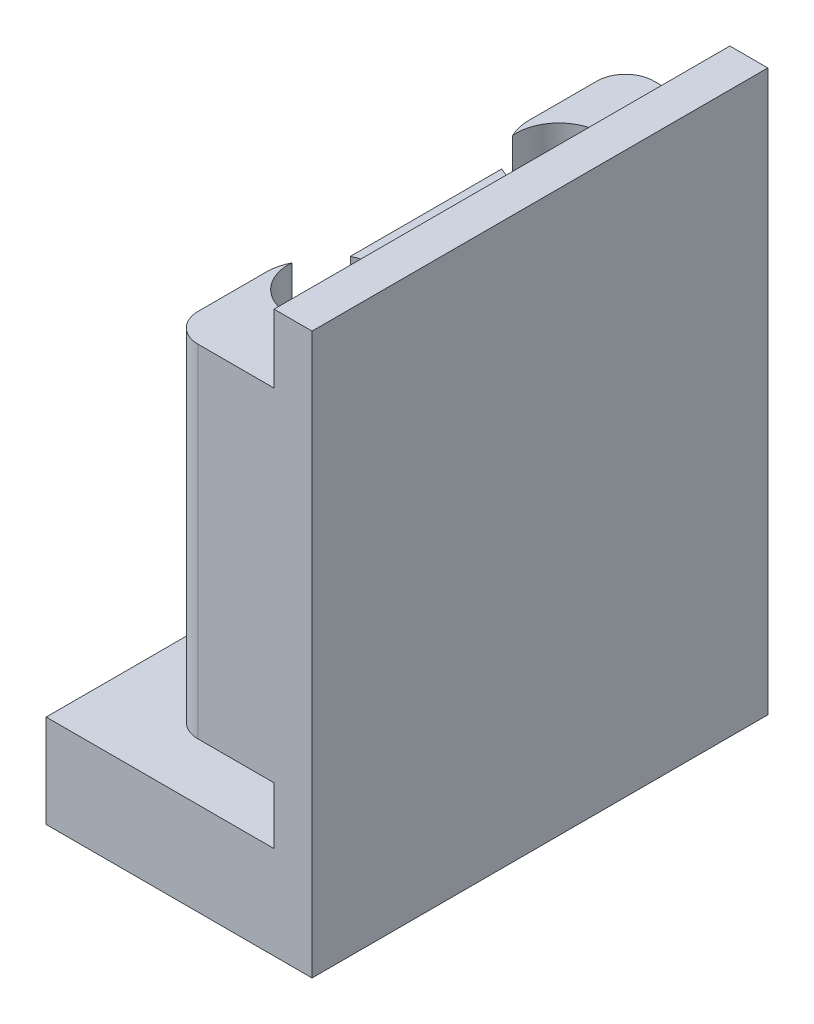
ISO-10303-21;
HEADER;
FILE_DESCRIPTION(('STEP AP214'),'2;1');
FILE_NAME('part.step','',(''),(''),'','','');
FILE_SCHEMA(('AUTOMOTIVE_DESIGN { 1 0 10303 214 1 1 1 1 }'));
ENDSEC;
DATA;
#1=APPLICATION_CONTEXT('core data for automotive mechanical design processes');
#2=APPLICATION_PROTOCOL_DEFINITION('international standard','automotive_design',2000,#1);
#3=PRODUCT_CONTEXT('',#1,'mechanical');
#4=PRODUCT('Part','Part','',(#3));
#5=PRODUCT_RELATED_PRODUCT_CATEGORY('part','',(#4));
#6=PRODUCT_DEFINITION_FORMATION('','',#4);
#7=PRODUCT_DEFINITION_CONTEXT('part definition',#1,'design');
#8=PRODUCT_DEFINITION('design','',#6,#7);
#9=PRODUCT_DEFINITION_SHAPE('','',#8);
#10=(LENGTH_UNIT() NAMED_UNIT(*) SI_UNIT(.MILLI.,.METRE.));
#11=(NAMED_UNIT(*) PLANE_ANGLE_UNIT() SI_UNIT($,.RADIAN.));
#12=(NAMED_UNIT(*) SI_UNIT($,.STERADIAN.) SOLID_ANGLE_UNIT());
#13=UNCERTAINTY_MEASURE_WITH_UNIT(LENGTH_MEASURE(1.E-05),#10,'distance_accuracy_value','');
#14=(GEOMETRIC_REPRESENTATION_CONTEXT(3) GLOBAL_UNCERTAINTY_ASSIGNED_CONTEXT((#13)) GLOBAL_UNIT_ASSIGNED_CONTEXT((#10,
#11,#12)) REPRESENTATION_CONTEXT('',''));
#15=CARTESIAN_POINT('',(0.,0.,0.));
#16=DIRECTION('',(0.,0.,1.));
#17=DIRECTION('',(1.,0.,0.));
#18=AXIS2_PLACEMENT_3D('',#15,#16,#17);
#19=CARTESIAN_POINT('',(0.500000000000001,25.9,12.));
#20=DIRECTION('',(1.,0.,0.));
#21=DIRECTION('',(0.,0.,-1.));
#22=AXIS2_PLACEMENT_3D('',#19,#20,#21);
#23=PLANE('',#22);
#24=DIRECTION('',(0.,0.,1.));
#25=VECTOR('',#24,1.);
#26=CARTESIAN_POINT('',(0.500000000000001,25.9,12.));
#27=LINE('',#26,#25);
#28=CARTESIAN_POINT('',(0.500000000000001,25.9,-10.5));
#29=VERTEX_POINT('',#28);
#30=CARTESIAN_POINT('',(0.500000000000001,25.9,-6.91628784747792));
#31=VERTEX_POINT('',#30);
#32=EDGE_CURVE('E200',#29,#31,#27,.T.);
#33=ORIENTED_EDGE('',*,*,#32,.F.);
#34=DIRECTION('',(0.,-1.,0.));
#35=VECTOR('',#34,1.);
#36=CARTESIAN_POINT('',(0.500000000000001,25.9,-10.5));
#37=LINE('',#36,#35);
#38=CARTESIAN_POINT('',(0.500000000000001,7.9,-10.5));
#39=VERTEX_POINT('',#38);
#40=EDGE_CURVE('E275',#29,#39,#37,.T.);
#41=ORIENTED_EDGE('',*,*,#40,.T.);
#42=DIRECTION('',(0.,0.,1.));
#43=VECTOR('',#42,1.);
#44=CARTESIAN_POINT('',(0.500000000000001,7.9,12.));
#45=LINE('',#44,#43);
#46=CARTESIAN_POINT('',(0.500000000000001,7.9,-6.91628784747792));
#47=VERTEX_POINT('',#46);
#48=EDGE_CURVE('E208',#39,#47,#45,.T.);
#49=ORIENTED_EDGE('',*,*,#48,.T.);
#50=DIRECTION('',(0.,1.,0.));
#51=VECTOR('',#50,1.);
#52=CARTESIAN_POINT('',(0.500000000000001,25.9,-6.91628784747792));
#53=LINE('',#52,#51);
#54=EDGE_CURVE('E268',#47,#31,#53,.T.);
#55=ORIENTED_EDGE('',*,*,#54,.T.);
#56=EDGE_LOOP('',(#33,#41,#49,#55));
#57=FACE_BOUND('',#56,.T.);
#58=ADVANCED_FACE('F34',(#57),#23,.F.);
#59=CARTESIAN_POINT('',(6.,29.5,12.));
#60=DIRECTION('',(1.,0.,0.));
#61=DIRECTION('',(0.,0.,-1.));
#62=AXIS2_PLACEMENT_3D('',#59,#60,#61);
#63=PLANE('',#62);
#64=DIRECTION('',(0.,0.,-1.));
#65=VECTOR('',#64,1.);
#66=CARTESIAN_POINT('',(6.,7.9,12.));
#67=LINE('',#66,#65);
#68=CARTESIAN_POINT('',(6.,7.9,12.));
#69=VERTEX_POINT('',#68);
#70=CARTESIAN_POINT('',(6.,7.9,-12.));
#71=VERTEX_POINT('',#70);
#72=EDGE_CURVE('E184',#69,#71,#67,.T.);
#73=ORIENTED_EDGE('',*,*,#72,.T.);
#74=DIRECTION('',(0.,-1.,0.));
#75=VECTOR('',#74,1.);
#76=CARTESIAN_POINT('',(6.,29.5,-12.));
#77=LINE('',#76,#75);
#78=CARTESIAN_POINT('',(6.,4.9,-12.));
#79=VERTEX_POINT('',#78);
#80=EDGE_CURVE('E220',#71,#79,#77,.T.);
#81=ORIENTED_EDGE('',*,*,#80,.T.);
#82=DIRECTION('',(0.,0.,-1.));
#83=VECTOR('',#82,1.);
#84=CARTESIAN_POINT('',(6.,4.9,12.));
#85=LINE('',#84,#83);
#86=CARTESIAN_POINT('',(6.,4.9,12.));
#87=VERTEX_POINT('',#86);
#88=EDGE_CURVE('E236',#87,#79,#85,.T.);
#89=ORIENTED_EDGE('',*,*,#88,.F.);
#90=DIRECTION('',(0.,-1.,0.));
#91=VECTOR('',#90,1.);
#92=CARTESIAN_POINT('',(6.,29.5,12.));
#93=LINE('',#92,#91);
#94=EDGE_CURVE('E231',#69,#87,#93,.T.);
#95=ORIENTED_EDGE('',*,*,#94,.F.);
#96=EDGE_LOOP('',(#73,#81,#89,#95));
#97=FACE_BOUND('',#96,.T.);
#98=ADVANCED_FACE('F301',(#97),#63,.F.);
#99=CARTESIAN_POINT('',(-6.,4.9,-12.));
#100=DIRECTION('',(0.,0.,1.));
#101=DIRECTION('',(1.,0.,0.));
#102=AXIS2_PLACEMENT_3D('',#99,#100,#101);
#103=PLANE('',#102);
#104=DIRECTION('',(-1.,0.,0.));
#105=VECTOR('',#104,1.);
#106=CARTESIAN_POINT('',(6.,7.9,-12.));
#107=LINE('',#106,#105);
#108=CARTESIAN_POINT('',(2.,7.9,-12.));
#109=VERTEX_POINT('',#108);
#110=EDGE_CURVE('E187',#71,#109,#107,.T.);
#111=ORIENTED_EDGE('',*,*,#110,.T.);
#112=DIRECTION('',(0.,-1.,0.));
#113=VECTOR('',#112,1.);
#114=CARTESIAN_POINT('',(2.,4.9,-12.));
#115=LINE('',#114,#113);
#116=CARTESIAN_POINT('',(2.,25.9,-12.));
#117=VERTEX_POINT('',#116);
#118=EDGE_CURVE('E282',#109,#117,#115,.F.);
#119=ORIENTED_EDGE('',*,*,#118,.T.);
#120=DIRECTION('',(-1.,0.,0.));
#121=VECTOR('',#120,1.);
#122=CARTESIAN_POINT('',(6.,25.9,-12.));
#123=LINE('',#122,#121);
#124=CARTESIAN_POINT('',(6.,25.9,-12.));
#125=VERTEX_POINT('',#124);
#126=EDGE_CURVE('E196',#125,#117,#123,.T.);
#127=ORIENTED_EDGE('',*,*,#126,.F.);
#128=CARTESIAN_POINT('',(6.,29.5,-12.));
#129=VERTEX_POINT('',#128);
#130=EDGE_CURVE('E223',#129,#125,#77,.T.);
#131=ORIENTED_EDGE('',*,*,#130,.F.);
#132=DIRECTION('',(-1.,0.,0.));
#133=VECTOR('',#132,1.);
#134=CARTESIAN_POINT('',(6.,29.5,-12.));
#135=LINE('',#134,#133);
#136=CARTESIAN_POINT('',(8.,29.5,-12.));
#137=VERTEX_POINT('',#136);
#138=EDGE_CURVE('E218',#137,#129,#135,.T.);
#139=ORIENTED_EDGE('',*,*,#138,.F.);
#140=DIRECTION('',(0.,-1.,0.));
#141=VECTOR('',#140,1.);
#142=CARTESIAN_POINT('',(8.,29.5,-12.));
#143=LINE('',#142,#141);
#144=CARTESIAN_POINT('',(8.,0.,-12.));
#145=VERTEX_POINT('',#144);
#146=EDGE_CURVE('E225',#137,#145,#143,.T.);
#147=ORIENTED_EDGE('',*,*,#146,.T.);
#148=DIRECTION('',(-1.,0.,0.));
#149=VECTOR('',#148,1.);
#150=CARTESIAN_POINT('',(-6.,0.,-12.));
#151=LINE('',#150,#149);
#152=CARTESIAN_POINT('',(-6.,0.,-12.));
#153=VERTEX_POINT('',#152);
#154=EDGE_CURVE('E235',#145,#153,#151,.T.);
#155=ORIENTED_EDGE('',*,*,#154,.T.);
#156=DIRECTION('',(0.,-1.,0.));
#157=VECTOR('',#156,1.);
#158=CARTESIAN_POINT('',(-6.,4.9,-12.));
#159=LINE('',#158,#157);
#160=CARTESIAN_POINT('',(-6.,4.9,-12.));
#161=VERTEX_POINT('',#160);
#162=EDGE_CURVE('E254',#161,#153,#159,.T.);
#163=ORIENTED_EDGE('',*,*,#162,.F.);
#164=DIRECTION('',(-1.,0.,0.));
#165=VECTOR('',#164,1.);
#166=CARTESIAN_POINT('',(-6.,4.9,-12.));
#167=LINE('',#166,#165);
#168=EDGE_CURVE('E239',#79,#161,#167,.T.);
#169=ORIENTED_EDGE('',*,*,#168,.F.);
#170=ORIENTED_EDGE('',*,*,#80,.F.);
#171=EDGE_LOOP('',(#111,#119,#127,#131,#139,#147,#155,#163,#169,#170));
#172=FACE_BOUND('',#171,.T.);
#173=ADVANCED_FACE('F305',(#172),#103,.F.);
#174=CARTESIAN_POINT('',(-6.,4.9,12.));
#175=DIRECTION('',(1.,0.,0.));
#176=DIRECTION('',(0.,0.,-1.));
#177=AXIS2_PLACEMENT_3D('',#174,#175,#176);
#178=PLANE('',#177);
#179=DIRECTION('',(0.,0.,1.));
#180=VECTOR('',#179,1.);
#181=CARTESIAN_POINT('',(-6.,0.,12.));
#182=LINE('',#181,#180);
#183=CARTESIAN_POINT('',(-6.,0.,12.));
#184=VERTEX_POINT('',#183);
#185=EDGE_CURVE('E249',#153,#184,#182,.T.);
#186=ORIENTED_EDGE('',*,*,#185,.T.);
#187=DIRECTION('',(0.,-1.,0.));
#188=VECTOR('',#187,1.);
#189=CARTESIAN_POINT('',(-6.,4.9,12.));
#190=LINE('',#189,#188);
#191=CARTESIAN_POINT('',(-6.,4.9,12.));
#192=VERTEX_POINT('',#191);
#193=EDGE_CURVE('E247',#192,#184,#190,.T.);
#194=ORIENTED_EDGE('',*,*,#193,.F.);
#195=DIRECTION('',(0.,0.,1.));
#196=VECTOR('',#195,1.);
#197=CARTESIAN_POINT('',(-6.,4.9,12.));
#198=LINE('',#197,#196);
#199=EDGE_CURVE('E242',#161,#192,#198,.T.);
#200=ORIENTED_EDGE('',*,*,#199,.F.);
#201=ORIENTED_EDGE('',*,*,#162,.T.);
#202=EDGE_LOOP('',(#186,#194,#200,#201));
#203=FACE_BOUND('',#202,.T.);
#204=ADVANCED_FACE('F415',(#203),#178,.F.);
#205=CARTESIAN_POINT('',(-6.,4.9,12.));
#206=DIRECTION('',(0.,0.,-1.));
#207=DIRECTION('',(-1.,0.,0.));
#208=AXIS2_PLACEMENT_3D('',#205,#206,#207);
#209=PLANE('',#208);
#210=DIRECTION('',(1.,0.,0.));
#211=VECTOR('',#210,1.);
#212=CARTESIAN_POINT('',(6.,25.9,12.));
#213=LINE('',#212,#211);
#214=CARTESIAN_POINT('',(2.,25.9,12.));
#215=VERTEX_POINT('',#214);
#216=CARTESIAN_POINT('',(6.,25.9,12.));
#217=VERTEX_POINT('',#216);
#218=EDGE_CURVE('E202',#215,#217,#213,.T.);
#219=ORIENTED_EDGE('',*,*,#218,.F.);
#220=DIRECTION('',(0.,-1.,0.));
#221=VECTOR('',#220,1.);
#222=CARTESIAN_POINT('',(2.,4.9,12.));
#223=LINE('',#222,#221);
#224=CARTESIAN_POINT('',(2.,7.9,12.));
#225=VERTEX_POINT('',#224);
#226=EDGE_CURVE('E42',#215,#225,#223,.T.);
#227=ORIENTED_EDGE('',*,*,#226,.T.);
#228=DIRECTION('',(1.,0.,0.));
#229=VECTOR('',#228,1.);
#230=CARTESIAN_POINT('',(6.,7.9,12.));
#231=LINE('',#230,#229);
#232=EDGE_CURVE('E197',#225,#69,#231,.T.);
#233=ORIENTED_EDGE('',*,*,#232,.T.);
#234=ORIENTED_EDGE('',*,*,#94,.T.);
#235=DIRECTION('',(1.,0.,0.));
#236=VECTOR('',#235,1.);
#237=CARTESIAN_POINT('',(-6.,4.9,12.));
#238=LINE('',#237,#236);
#239=EDGE_CURVE('E244',#192,#87,#238,.T.);
#240=ORIENTED_EDGE('',*,*,#239,.F.);
#241=ORIENTED_EDGE('',*,*,#193,.T.);
#242=DIRECTION('',(1.,0.,0.));
#243=VECTOR('',#242,1.);
#244=CARTESIAN_POINT('',(-6.,0.,12.));
#245=LINE('',#244,#243);
#246=CARTESIAN_POINT('',(8.,0.,12.));
#247=VERTEX_POINT('',#246);
#248=EDGE_CURVE('E240',#184,#247,#245,.T.);
#249=ORIENTED_EDGE('',*,*,#248,.T.);
#250=DIRECTION('',(0.,-1.,0.));
#251=VECTOR('',#250,1.);
#252=CARTESIAN_POINT('',(8.,29.5,12.));
#253=LINE('',#252,#251);
#254=CARTESIAN_POINT('',(8.,29.5,12.));
#255=VERTEX_POINT('',#254);
#256=EDGE_CURVE('E228',#255,#247,#253,.T.);
#257=ORIENTED_EDGE('',*,*,#256,.F.);
#258=DIRECTION('',(1.,0.,0.));
#259=VECTOR('',#258,1.);
#260=CARTESIAN_POINT('',(6.,29.5,12.));
#261=LINE('',#260,#259);
#262=CARTESIAN_POINT('',(6.,29.5,12.));
#263=VERTEX_POINT('',#262);
#264=EDGE_CURVE('E214',#263,#255,#261,.T.);
#265=ORIENTED_EDGE('',*,*,#264,.F.);
#266=EDGE_CURVE('E232',#263,#217,#93,.T.);
#267=ORIENTED_EDGE('',*,*,#266,.T.);
#268=EDGE_LOOP('',(#219,#227,#233,#234,#240,#241,#249,#257,#265,#267));
#269=FACE_BOUND('',#268,.T.);
#270=ADVANCED_FACE('F290',(#269),#209,.F.);
#271=CARTESIAN_POINT('',(0.,4.9,0.));
#272=DIRECTION('',(0.,-1.,0.));
#273=DIRECTION('',(0.,0.,-1.));
#274=AXIS2_PLACEMENT_3D('',#271,#272,#273);
#275=PLANE('',#274);
#276=CARTESIAN_POINT('',(3.,4.9,6.));
#277=DIRECTION('',(0.,-1.,0.));
#278=DIRECTION('',(0.,0.,-1.));
#279=AXIS2_PLACEMENT_3D('',#276,#277,#278);
#280=CIRCLE('',#279,2.25);
#281=CARTESIAN_POINT('',(3.,4.9,8.25));
#282=VERTEX_POINT('',#281);
#283=EDGE_CURVE('E189',#282,#282,#280,.T.);
#284=ORIENTED_EDGE('',*,*,#283,.T.);
#285=EDGE_LOOP('',(#284));
#286=FACE_BOUND('',#285,.T.);
#287=CARTESIAN_POINT('',(3.,4.9,-6.));
#288=DIRECTION('',(0.,-1.,0.));
#289=DIRECTION('',(0.,0.,-1.));
#290=AXIS2_PLACEMENT_3D('',#287,#288,#289);
#291=CIRCLE('',#290,2.25);
#292=CARTESIAN_POINT('',(3.,4.9,-3.75));
#293=VERTEX_POINT('',#292);
#294=EDGE_CURVE('E169',#293,#293,#291,.T.);
#295=ORIENTED_EDGE('',*,*,#294,.T.);
#296=EDGE_LOOP('',(#295));
#297=FACE_BOUND('',#296,.T.);
#298=ORIENTED_EDGE('',*,*,#88,.T.);
#299=ORIENTED_EDGE('',*,*,#168,.T.);
#300=ORIENTED_EDGE('',*,*,#199,.T.);
#301=ORIENTED_EDGE('',*,*,#239,.T.);
#302=EDGE_LOOP('',(#298,#299,#300,#301));
#303=FACE_BOUND('',#302,.T.);
#304=ADVANCED_FACE('F310',(#286,#297,#303),#275,.F.);
#305=CARTESIAN_POINT('',(0.,0.,0.));
#306=DIRECTION('',(0.,-1.,0.));
#307=DIRECTION('',(0.,0.,-1.));
#308=AXIS2_PLACEMENT_3D('',#305,#306,#307);
#309=PLANE('',#308);
#310=CARTESIAN_POINT('',(3.,0.,6.));
#311=DIRECTION('',(0.,1.,0.));
#312=DIRECTION('',(0.,0.,1.));
#313=AXIS2_PLACEMENT_3D('',#310,#311,#312);
#314=CIRCLE('',#313,2.25);
#315=CARTESIAN_POINT('',(3.,0.,8.25));
#316=VERTEX_POINT('',#315);
#317=EDGE_CURVE('E560',#316,#316,#314,.T.);
#318=ORIENTED_EDGE('',*,*,#317,.T.);
#319=EDGE_LOOP('',(#318));
#320=FACE_BOUND('',#319,.T.);
#321=CARTESIAN_POINT('',(3.,0.,-6.));
#322=DIRECTION('',(0.,1.,0.));
#323=DIRECTION('',(0.,0.,1.));
#324=AXIS2_PLACEMENT_3D('',#321,#322,#323);
#325=CIRCLE('',#324,2.25);
#326=CARTESIAN_POINT('',(3.,0.,-3.75));
#327=VERTEX_POINT('',#326);
#328=EDGE_CURVE('E179',#327,#327,#325,.T.);
#329=ORIENTED_EDGE('',*,*,#328,.T.);
#330=EDGE_LOOP('',(#329));
#331=FACE_BOUND('',#330,.T.);
#332=ORIENTED_EDGE('',*,*,#154,.F.);
#333=DIRECTION('',(0.,0.,-1.));
#334=VECTOR('',#333,1.);
#335=CARTESIAN_POINT('',(8.,0.,12.));
#336=LINE('',#335,#334);
#337=EDGE_CURVE('E203',#247,#145,#336,.T.);
#338=ORIENTED_EDGE('',*,*,#337,.F.);
#339=ORIENTED_EDGE('',*,*,#248,.F.);
#340=ORIENTED_EDGE('',*,*,#185,.F.);
#341=EDGE_LOOP('',(#332,#338,#339,#340));
#342=FACE_BOUND('',#341,.T.);
#343=ADVANCED_FACE('F319',(#320,#331,#342),#309,.T.);
#344=ORIENTED_EDGE('',*,*,#130,.T.);
#345=DIRECTION('',(0.,0.,-1.));
#346=VECTOR('',#345,1.);
#347=CARTESIAN_POINT('',(6.,25.9,12.));
#348=LINE('',#347,#346);
#349=EDGE_CURVE('E193',#217,#125,#348,.T.);
#350=ORIENTED_EDGE('',*,*,#349,.F.);
#351=ORIENTED_EDGE('',*,*,#266,.F.);
#352=DIRECTION('',(0.,0.,1.));
#353=VECTOR('',#352,1.);
#354=CARTESIAN_POINT('',(6.,29.5,12.));
#355=LINE('',#354,#353);
#356=EDGE_CURVE('E211',#129,#263,#355,.T.);
#357=ORIENTED_EDGE('',*,*,#356,.F.);
#358=EDGE_LOOP('',(#344,#350,#351,#357));
#359=FACE_BOUND('',#358,.T.);
#360=ADVANCED_FACE('F333',(#359),#63,.F.);
#361=CARTESIAN_POINT('',(8.,29.5,12.));
#362=DIRECTION('',(-1.,0.,0.));
#363=DIRECTION('',(0.,0.,1.));
#364=AXIS2_PLACEMENT_3D('',#361,#362,#363);
#365=PLANE('',#364);
#366=ORIENTED_EDGE('',*,*,#337,.T.);
#367=ORIENTED_EDGE('',*,*,#146,.F.);
#368=DIRECTION('',(0.,0.,-1.));
#369=VECTOR('',#368,1.);
#370=CARTESIAN_POINT('',(8.,29.5,12.));
#371=LINE('',#370,#369);
#372=EDGE_CURVE('E216',#255,#137,#371,.T.);
#373=ORIENTED_EDGE('',*,*,#372,.F.);
#374=ORIENTED_EDGE('',*,*,#256,.T.);
#375=EDGE_LOOP('',(#366,#367,#373,#374));
#376=FACE_BOUND('',#375,.T.);
#377=ADVANCED_FACE('F322',(#376),#365,.F.);
#378=CARTESIAN_POINT('',(0.,29.5,0.));
#379=DIRECTION('',(0.,-1.,0.));
#380=DIRECTION('',(0.,0.,-1.));
#381=AXIS2_PLACEMENT_3D('',#378,#379,#380);
#382=PLANE('',#381);
#383=ORIENTED_EDGE('',*,*,#356,.T.);
#384=ORIENTED_EDGE('',*,*,#264,.T.);
#385=ORIENTED_EDGE('',*,*,#372,.T.);
#386=ORIENTED_EDGE('',*,*,#138,.T.);
#387=EDGE_LOOP('',(#383,#384,#385,#386));
#388=FACE_BOUND('',#387,.T.);
#389=ADVANCED_FACE('F329',(#388),#382,.F.);
#390=CARTESIAN_POINT('',(0.500000000000001,7.9,6.91628784747793));
#391=VERTEX_POINT('',#390);
#392=CARTESIAN_POINT('',(0.500000000000001,7.9,10.5));
#393=VERTEX_POINT('',#392);
#394=EDGE_CURVE('E207',#391,#393,#45,.T.);
#395=ORIENTED_EDGE('',*,*,#394,.T.);
#396=DIRECTION('',(0.,-1.,0.));
#397=VECTOR('',#396,1.);
#398=CARTESIAN_POINT('',(0.500000000000001,25.9,10.5));
#399=LINE('',#398,#397);
#400=CARTESIAN_POINT('',(0.500000000000001,25.9,10.5));
#401=VERTEX_POINT('',#400);
#402=EDGE_CURVE('E11',#393,#401,#399,.F.);
#403=ORIENTED_EDGE('',*,*,#402,.T.);
#404=CARTESIAN_POINT('',(0.500000000000001,25.9,6.91628784747792));
#405=VERTEX_POINT('',#404);
#406=EDGE_CURVE('E199',#405,#401,#27,.T.);
#407=ORIENTED_EDGE('',*,*,#406,.F.);
#408=DIRECTION('',(0.,-1.,0.));
#409=VECTOR('',#408,1.);
#410=CARTESIAN_POINT('',(0.500000000000001,25.9,6.91628784747792));
#411=LINE('',#410,#409);
#412=EDGE_CURVE('E260',#405,#391,#411,.T.);
#413=ORIENTED_EDGE('',*,*,#412,.T.);
#414=EDGE_LOOP('',(#395,#403,#407,#413));
#415=FACE_BOUND('',#414,.T.);
#416=ADVANCED_FACE('F358',(#415),#23,.F.);
#417=CARTESIAN_POINT('',(0.,25.9,0.));
#418=DIRECTION('',(0.,1.,0.));
#419=DIRECTION('',(0.,0.,1.));
#420=AXIS2_PLACEMENT_3D('',#417,#418,#419);
#421=PLANE('',#420);
#422=ORIENTED_EDGE('',*,*,#126,.T.);
#423=CARTESIAN_POINT('',(2.,25.9,-10.5));
#424=DIRECTION('',(0.,1.,0.));
#425=DIRECTION('',(0.,0.,1.));
#426=AXIS2_PLACEMENT_3D('',#423,#424,#425);
#427=CIRCLE('',#426,1.5);
#428=EDGE_CURVE('E285',#117,#29,#427,.T.);
#429=ORIENTED_EDGE('',*,*,#428,.T.);
#430=ORIENTED_EDGE('',*,*,#32,.T.);
#431=CARTESIAN_POINT('',(3.,25.9,-6.91628784747792));
#432=DIRECTION('',(0.,1.,0.));
#433=DIRECTION('',(0.,0.,1.));
#434=AXIS2_PLACEMENT_3D('',#431,#432,#433);
#435=CIRCLE('',#434,2.5);
#436=CARTESIAN_POINT('',(0.758023964105944,25.9,-5.81014886232426));
#437=VERTEX_POINT('',#436);
#438=EDGE_CURVE('E178',#31,#437,#435,.T.);
#439=ORIENTED_EDGE('',*,*,#438,.T.);
#440=CARTESIAN_POINT('',(3.,25.9,-6.));
#441=DIRECTION('',(0.,1.,0.));
#442=DIRECTION('',(0.,0.,1.));
#443=AXIS2_PLACEMENT_3D('',#440,#441,#442);
#444=CIRCLE('',#443,2.25);
#445=CARTESIAN_POINT('',(2.,25.9,-3.98443556292536));
#446=VERTEX_POINT('',#445);
#447=EDGE_CURVE('E161',#446,#437,#444,.T.);
#448=ORIENTED_EDGE('',*,*,#447,.F.);
#449=DIRECTION('',(0.,0.,-1.));
#450=VECTOR('',#449,1.);
#451=CARTESIAN_POINT('',(2.,25.9,-4.625));
#452=LINE('',#451,#450);
#453=CARTESIAN_POINT('',(2.,25.9,3.98443556292536));
#454=VERTEX_POINT('',#453);
#455=EDGE_CURVE('E176',#454,#446,#452,.T.);
#456=ORIENTED_EDGE('',*,*,#455,.F.);
#457=CARTESIAN_POINT('',(3.,25.9,6.));
#458=DIRECTION('',(0.,1.,0.));
#459=DIRECTION('',(0.,0.,1.));
#460=AXIS2_PLACEMENT_3D('',#457,#458,#459);
#461=CIRCLE('',#460,2.25);
#462=CARTESIAN_POINT('',(0.758023964105944,25.9,5.81014886232426));
#463=VERTEX_POINT('',#462);
#464=EDGE_CURVE('E396',#463,#454,#461,.T.);
#465=ORIENTED_EDGE('',*,*,#464,.F.);
#466=CARTESIAN_POINT('',(3.,25.9,6.91628784747792));
#467=DIRECTION('',(0.,1.,0.));
#468=DIRECTION('',(0.,0.,1.));
#469=AXIS2_PLACEMENT_3D('',#466,#467,#468);
#470=CIRCLE('',#469,2.5);
#471=EDGE_CURVE('E258',#463,#405,#470,.T.);
#472=ORIENTED_EDGE('',*,*,#471,.T.);
#473=ORIENTED_EDGE('',*,*,#406,.T.);
#474=CARTESIAN_POINT('',(2.,25.9,10.5));
#475=DIRECTION('',(0.,1.,0.));
#476=DIRECTION('',(0.,0.,1.));
#477=AXIS2_PLACEMENT_3D('',#474,#475,#476);
#478=CIRCLE('',#477,1.5);
#479=EDGE_CURVE('E49',#401,#215,#478,.T.);
#480=ORIENTED_EDGE('',*,*,#479,.T.);
#481=ORIENTED_EDGE('',*,*,#218,.T.);
#482=ORIENTED_EDGE('',*,*,#349,.T.);
#483=EDGE_LOOP('',(#422,#429,#430,#439,#448,#456,#465,#472,#473,#480,#481,#482));
#484=FACE_BOUND('',#483,.T.);
#485=ADVANCED_FACE('F174',(#484),#421,.T.);
#486=CARTESIAN_POINT('',(0.,7.9,0.));
#487=DIRECTION('',(0.,1.,0.));
#488=DIRECTION('',(0.,0.,1.));
#489=AXIS2_PLACEMENT_3D('',#486,#487,#488);
#490=PLANE('',#489);
#491=ORIENTED_EDGE('',*,*,#48,.F.);
#492=CARTESIAN_POINT('',(2.,7.9,-10.5));
#493=DIRECTION('',(0.,1.,0.));
#494=DIRECTION('',(0.,0.,1.));
#495=AXIS2_PLACEMENT_3D('',#492,#493,#494);
#496=CIRCLE('',#495,1.5);
#497=EDGE_CURVE('E280',#39,#109,#496,.F.);
#498=ORIENTED_EDGE('',*,*,#497,.T.);
#499=ORIENTED_EDGE('',*,*,#110,.F.);
#500=ORIENTED_EDGE('',*,*,#72,.F.);
#501=ORIENTED_EDGE('',*,*,#232,.F.);
#502=CARTESIAN_POINT('',(2.,7.9,10.5));
#503=DIRECTION('',(0.,1.,0.));
#504=DIRECTION('',(0.,0.,1.));
#505=AXIS2_PLACEMENT_3D('',#502,#503,#504);
#506=CIRCLE('',#505,1.5);
#507=EDGE_CURVE('E278',#225,#393,#506,.F.);
#508=ORIENTED_EDGE('',*,*,#507,.T.);
#509=ORIENTED_EDGE('',*,*,#394,.F.);
#510=CARTESIAN_POINT('',(3.,7.9,6.91628784747793));
#511=DIRECTION('',(0.,1.,0.));
#512=DIRECTION('',(0.,0.,1.));
#513=AXIS2_PLACEMENT_3D('',#510,#511,#512);
#514=CIRCLE('',#513,2.5);
#515=CARTESIAN_POINT('',(0.758023964105943,7.9,5.81014886232427));
#516=VERTEX_POINT('',#515);
#517=EDGE_CURVE('E265',#391,#516,#514,.F.);
#518=ORIENTED_EDGE('',*,*,#517,.T.);
#519=CARTESIAN_POINT('',(3.,7.9,6.));
#520=DIRECTION('',(0.,1.,0.));
#521=DIRECTION('',(0.,0.,1.));
#522=AXIS2_PLACEMENT_3D('',#519,#520,#521);
#523=CIRCLE('',#522,2.25);
#524=CARTESIAN_POINT('',(2.,7.9,3.98443556292536));
#525=VERTEX_POINT('',#524);
#526=EDGE_CURVE('E394',#516,#525,#523,.T.);
#527=ORIENTED_EDGE('',*,*,#526,.T.);
#528=DIRECTION('',(0.,0.,1.));
#529=VECTOR('',#528,1.);
#530=CARTESIAN_POINT('',(2.,7.9,-4.625));
#531=LINE('',#530,#529);
#532=CARTESIAN_POINT('',(2.,7.9,-3.98443556292536));
#533=VERTEX_POINT('',#532);
#534=EDGE_CURVE('E185',#533,#525,#531,.T.);
#535=ORIENTED_EDGE('',*,*,#534,.F.);
#536=CARTESIAN_POINT('',(3.,7.9,-6.));
#537=DIRECTION('',(0.,1.,0.));
#538=DIRECTION('',(0.,0.,1.));
#539=AXIS2_PLACEMENT_3D('',#536,#537,#538);
#540=CIRCLE('',#539,2.25);
#541=CARTESIAN_POINT('',(0.758023964105944,7.9,-5.81014886232426));
#542=VERTEX_POINT('',#541);
#543=EDGE_CURVE('E164',#533,#542,#540,.T.);
#544=ORIENTED_EDGE('',*,*,#543,.T.);
#545=CARTESIAN_POINT('',(3.,7.9,-6.91628784747792));
#546=DIRECTION('',(0.,1.,0.));
#547=DIRECTION('',(0.,0.,1.));
#548=AXIS2_PLACEMENT_3D('',#545,#546,#547);
#549=CIRCLE('',#548,2.5);
#550=EDGE_CURVE('E262',#542,#47,#549,.F.);
#551=ORIENTED_EDGE('',*,*,#550,.T.);
#552=EDGE_LOOP('',(#491,#498,#499,#500,#501,#508,#509,#518,#527,#535,#544,#551));
#553=FACE_BOUND('',#552,.T.);
#554=ADVANCED_FACE('F296',(#553),#490,.F.);
#555=CARTESIAN_POINT('',(2.,0.,0.));
#556=DIRECTION('',(-1.,0.,0.));
#557=DIRECTION('',(0.,0.,1.));
#558=AXIS2_PLACEMENT_3D('',#555,#556,#557);
#559=PLANE('',#558);
#560=DIRECTION('',(0.,1.,0.));
#561=VECTOR('',#560,1.);
#562=CARTESIAN_POINT('',(2.,0.,3.98443556292536));
#563=LINE('',#562,#561);
#564=EDGE_CURVE('E183',#454,#525,#563,.F.);
#565=ORIENTED_EDGE('',*,*,#564,.F.);
#566=ORIENTED_EDGE('',*,*,#455,.T.);
#567=DIRECTION('',(0.,1.,0.));
#568=VECTOR('',#567,1.);
#569=CARTESIAN_POINT('',(2.,0.,-3.98443556292536));
#570=LINE('',#569,#568);
#571=EDGE_CURVE('E158',#533,#446,#570,.T.);
#572=ORIENTED_EDGE('',*,*,#571,.F.);
#573=ORIENTED_EDGE('',*,*,#534,.T.);
#574=EDGE_LOOP('',(#565,#566,#572,#573));
#575=FACE_BOUND('',#574,.T.);
#576=ADVANCED_FACE('F182',(#575),#559,.T.);
#577=CARTESIAN_POINT('',(3.,25.9,6.91628784747792));
#578=DIRECTION('',(0.,-1.,0.));
#579=DIRECTION('',(0.,0.,-1.));
#580=AXIS2_PLACEMENT_3D('',#577,#578,#579);
#581=CYLINDRICAL_SURFACE('',#580,2.5);
#582=DIRECTION('',(0.,1.,0.));
#583=VECTOR('',#582,1.);
#584=CARTESIAN_POINT('',(0.758023964105944,12.95,5.81014886232427));
#585=LINE('',#584,#583);
#586=EDGE_CURVE('E273',#516,#463,#585,.T.);
#587=ORIENTED_EDGE('',*,*,#586,.F.);
#588=ORIENTED_EDGE('',*,*,#517,.F.);
#589=ORIENTED_EDGE('',*,*,#412,.F.);
#590=ORIENTED_EDGE('',*,*,#471,.F.);
#591=EDGE_LOOP('',(#587,#588,#589,#590));
#592=FACE_BOUND('',#591,.T.);
#593=ADVANCED_FACE('F345',(#592),#581,.T.);
#594=CARTESIAN_POINT('',(3.,25.9,-6.91628784747792));
#595=DIRECTION('',(0.,1.,0.));
#596=DIRECTION('',(0.,0.,1.));
#597=AXIS2_PLACEMENT_3D('',#594,#595,#596);
#598=CYLINDRICAL_SURFACE('',#597,2.5);
#599=DIRECTION('',(0.,1.,0.));
#600=VECTOR('',#599,1.);
#601=CARTESIAN_POINT('',(0.758023964105944,12.95,-5.81014886232426));
#602=LINE('',#601,#600);
#603=EDGE_CURVE('E271',#437,#542,#602,.F.);
#604=ORIENTED_EDGE('',*,*,#603,.F.);
#605=ORIENTED_EDGE('',*,*,#438,.F.);
#606=ORIENTED_EDGE('',*,*,#54,.F.);
#607=ORIENTED_EDGE('',*,*,#550,.F.);
#608=EDGE_LOOP('',(#604,#605,#606,#607));
#609=FACE_BOUND('',#608,.T.);
#610=ADVANCED_FACE('F343',(#609),#598,.T.);
#611=CARTESIAN_POINT('',(3.,0.,-6.));
#612=DIRECTION('',(0.,1.,0.));
#613=DIRECTION('',(0.,0.,1.));
#614=AXIS2_PLACEMENT_3D('',#611,#612,#613);
#615=CYLINDRICAL_SURFACE('',#614,2.25);
#616=ORIENTED_EDGE('',*,*,#571,.T.);
#617=ORIENTED_EDGE('',*,*,#447,.T.);
#618=ORIENTED_EDGE('',*,*,#603,.T.);
#619=ORIENTED_EDGE('',*,*,#543,.F.);
#620=EDGE_LOOP('',(#616,#617,#618,#619));
#621=FACE_BOUND('',#620,.T.);
#622=ADVANCED_FACE('F160',(#621),#615,.F.);
#623=CARTESIAN_POINT('',(3.,0.,6.));
#624=DIRECTION('',(0.,1.,0.));
#625=DIRECTION('',(0.,0.,1.));
#626=AXIS2_PLACEMENT_3D('',#623,#624,#625);
#627=CYLINDRICAL_SURFACE('',#626,2.25);
#628=ORIENTED_EDGE('',*,*,#564,.T.);
#629=ORIENTED_EDGE('',*,*,#526,.F.);
#630=ORIENTED_EDGE('',*,*,#586,.T.);
#631=ORIENTED_EDGE('',*,*,#464,.T.);
#632=EDGE_LOOP('',(#628,#629,#630,#631));
#633=FACE_BOUND('',#632,.T.);
#634=ADVANCED_FACE('F351',(#633),#627,.F.);
#635=CARTESIAN_POINT('',(3.,0.,-3.75));
#636=CARTESIAN_POINT('',(3.,0.0510416666666668,-3.75));
#637=CARTESIAN_POINT('',(3.,0.102083333333333,-3.75));
#638=CARTESIAN_POINT('',(3.,0.204166666666667,-3.75));
#639=CARTESIAN_POINT('',(3.,0.255208333333333,-3.75));
#640=CARTESIAN_POINT('',(3.,0.357291666666667,-3.75));
#641=CARTESIAN_POINT('',(3.,0.408333333333333,-3.75));
#642=CARTESIAN_POINT('',(3.,0.510416666666667,-3.75));
#643=CARTESIAN_POINT('',(3.,0.561458333333333,-3.75));
#644=CARTESIAN_POINT('',(3.,0.663541666666667,-3.75));
#645=CARTESIAN_POINT('',(3.,0.714583333333333,-3.75));
#646=CARTESIAN_POINT('',(3.,0.816666666666667,-3.75));
#647=CARTESIAN_POINT('',(3.,0.867708333333334,-3.75));
#648=CARTESIAN_POINT('',(3.,0.969791666666667,-3.75));
#649=CARTESIAN_POINT('',(3.,1.02083333333333,-3.75));
#650=CARTESIAN_POINT('',(3.,1.12291666666667,-3.75));
#651=CARTESIAN_POINT('',(3.,1.17395833333333,-3.75));
#652=CARTESIAN_POINT('',(3.,1.27604166666667,-3.75));
#653=CARTESIAN_POINT('',(3.,1.32708333333333,-3.75));
#654=CARTESIAN_POINT('',(3.,1.42916666666667,-3.75));
#655=CARTESIAN_POINT('',(3.,1.48020833333333,-3.75));
#656=CARTESIAN_POINT('',(3.,1.58229166666667,-3.75));
#657=CARTESIAN_POINT('',(3.,1.63333333333333,-3.75));
#658=CARTESIAN_POINT('',(3.,1.73541666666667,-3.75));
#659=CARTESIAN_POINT('',(3.,1.78645833333333,-3.75));
#660=CARTESIAN_POINT('',(3.,1.88854166666667,-3.75));
#661=CARTESIAN_POINT('',(3.,1.93958333333333,-3.75));
#662=CARTESIAN_POINT('',(3.,2.04166666666667,-3.75));
#663=CARTESIAN_POINT('',(3.,2.09270833333333,-3.75));
#664=CARTESIAN_POINT('',(3.,2.19479166666667,-3.75));
#665=CARTESIAN_POINT('',(3.,2.24583333333333,-3.75));
#666=CARTESIAN_POINT('',(3.,2.34791666666667,-3.75));
#667=CARTESIAN_POINT('',(3.,2.39895833333333,-3.75));
#668=CARTESIAN_POINT('',(3.,2.50104166666667,-3.75));
#669=CARTESIAN_POINT('',(3.,2.55208333333333,-3.75));
#670=CARTESIAN_POINT('',(3.,2.65416666666667,-3.75));
#671=CARTESIAN_POINT('',(3.,2.70520833333333,-3.75));
#672=CARTESIAN_POINT('',(3.,2.80729166666667,-3.75));
#673=CARTESIAN_POINT('',(3.,2.85833333333333,-3.75));
#674=CARTESIAN_POINT('',(3.,2.96041666666667,-3.75));
#675=CARTESIAN_POINT('',(3.,3.01145833333333,-3.75));
#676=CARTESIAN_POINT('',(3.,3.11354166666667,-3.75));
#677=CARTESIAN_POINT('',(3.,3.16458333333333,-3.75));
#678=CARTESIAN_POINT('',(3.,3.26666666666667,-3.75));
#679=CARTESIAN_POINT('',(3.,3.31770833333333,-3.75));
#680=CARTESIAN_POINT('',(3.,3.41979166666667,-3.75));
#681=CARTESIAN_POINT('',(3.,3.47083333333333,-3.75));
#682=CARTESIAN_POINT('',(3.,3.57291666666667,-3.75));
#683=CARTESIAN_POINT('',(3.,3.62395833333333,-3.75));
#684=CARTESIAN_POINT('',(3.,3.72604166666667,-3.75));
#685=CARTESIAN_POINT('',(3.,3.77708333333333,-3.75));
#686=CARTESIAN_POINT('',(3.,3.87916666666667,-3.75));
#687=CARTESIAN_POINT('',(3.,3.93020833333333,-3.75));
#688=CARTESIAN_POINT('',(3.,4.03229166666667,-3.75));
#689=CARTESIAN_POINT('',(3.,4.08333333333333,-3.75));
#690=CARTESIAN_POINT('',(3.,4.18541666666667,-3.75));
#691=CARTESIAN_POINT('',(3.,4.23645833333333,-3.75));
#692=CARTESIAN_POINT('',(3.,4.33854166666667,-3.75));
#693=CARTESIAN_POINT('',(3.,4.38958333333333,-3.75));
#694=CARTESIAN_POINT('',(3.,4.49166666666667,-3.75));
#695=CARTESIAN_POINT('',(3.,4.54270833333333,-3.75));
#696=CARTESIAN_POINT('',(3.,4.64479166666667,-3.75));
#697=CARTESIAN_POINT('',(3.,4.69583333333333,-3.75));
#698=CARTESIAN_POINT('',(3.,4.79791666666667,-3.75));
#699=CARTESIAN_POINT('',(3.,4.84895833333333,-3.75));
#700=CARTESIAN_POINT('',(3.,4.9,-3.75));
#701=B_SPLINE_CURVE_WITH_KNOTS('',3,(#635,#636,#637,#638,#639,#640,#641,#642,#643,#644,#645,
#646,#647,#648,#649,#650,#651,#652,#653,#654,#655,#656,#657,#658,#659,#660,#661,#662,#663,#664,
#665,#666,#667,#668,#669,#670,#671,#672,#673,#674,#675,#676,#677,#678,#679,#680,#681,#682,#683,
#684,#685,#686,#687,#688,#689,#690,#691,#692,#693,#694,#695,#696,#697,#698,#699,#700),
.UNSPECIFIED.,.F.,.F.,(4,2,2,2,2,2,2,2,2,2,2,2,2,2,2,2,2,2,2,2,2,2,2,2,2,2,2,2,2,2,2,2,4),(0.,
0.153125,0.30625,0.459375,0.6125,0.765625,0.91875,1.071875,1.225,1.378125,1.53125,1.684375,
1.8375,1.990625,2.14375,2.296875,2.45,2.603125,2.75625,2.909375,3.0625,3.215625,3.36875,
3.521875,3.675,3.828125,3.98125,4.134375,4.2875,4.440625,4.59375,4.746875,4.9),.UNSPECIFIED.);
#702=EDGE_CURVE('BSEAM353',#327,#293,#701,.T.);
#703=ORIENTED_EDGE('',*,*,#328,.F.);
#704=ORIENTED_EDGE('',*,*,#294,.F.);
#705=ORIENTED_EDGE('',*,*,#702,.T.);
#706=ORIENTED_EDGE('',*,*,#702,.F.);
#707=EDGE_LOOP('',(#703,#705,#704,#706));
#708=FACE_BOUND('',#707,.T.);
#709=ADVANCED_FACE('F353',(#708),#615,.F.);
#710=CARTESIAN_POINT('',(3.,0.,8.25));
#711=CARTESIAN_POINT('',(3.,0.0510416666666668,8.25));
#712=CARTESIAN_POINT('',(3.,0.102083333333333,8.25));
#713=CARTESIAN_POINT('',(3.,0.204166666666667,8.25));
#714=CARTESIAN_POINT('',(3.,0.255208333333333,8.25));
#715=CARTESIAN_POINT('',(3.,0.357291666666667,8.25));
#716=CARTESIAN_POINT('',(3.,0.408333333333333,8.25));
#717=CARTESIAN_POINT('',(3.,0.510416666666667,8.25));
#718=CARTESIAN_POINT('',(3.,0.561458333333333,8.25));
#719=CARTESIAN_POINT('',(3.,0.663541666666667,8.25));
#720=CARTESIAN_POINT('',(3.,0.714583333333333,8.25));
#721=CARTESIAN_POINT('',(3.,0.816666666666667,8.25));
#722=CARTESIAN_POINT('',(3.,0.867708333333334,8.25));
#723=CARTESIAN_POINT('',(3.,0.969791666666667,8.25));
#724=CARTESIAN_POINT('',(3.,1.02083333333333,8.25));
#725=CARTESIAN_POINT('',(3.,1.12291666666667,8.25));
#726=CARTESIAN_POINT('',(3.,1.17395833333333,8.25));
#727=CARTESIAN_POINT('',(3.,1.27604166666667,8.25));
#728=CARTESIAN_POINT('',(3.,1.32708333333333,8.25));
#729=CARTESIAN_POINT('',(3.,1.42916666666667,8.25));
#730=CARTESIAN_POINT('',(3.,1.48020833333333,8.25));
#731=CARTESIAN_POINT('',(3.,1.58229166666667,8.25));
#732=CARTESIAN_POINT('',(3.,1.63333333333333,8.25));
#733=CARTESIAN_POINT('',(3.,1.73541666666667,8.25));
#734=CARTESIAN_POINT('',(3.,1.78645833333333,8.25));
#735=CARTESIAN_POINT('',(3.,1.88854166666667,8.25));
#736=CARTESIAN_POINT('',(3.,1.93958333333333,8.25));
#737=CARTESIAN_POINT('',(3.,2.04166666666667,8.25));
#738=CARTESIAN_POINT('',(3.,2.09270833333333,8.25));
#739=CARTESIAN_POINT('',(3.,2.19479166666667,8.25));
#740=CARTESIAN_POINT('',(3.,2.24583333333333,8.25));
#741=CARTESIAN_POINT('',(3.,2.34791666666667,8.25));
#742=CARTESIAN_POINT('',(3.,2.39895833333333,8.25));
#743=CARTESIAN_POINT('',(3.,2.50104166666667,8.25));
#744=CARTESIAN_POINT('',(3.,2.55208333333333,8.25));
#745=CARTESIAN_POINT('',(3.,2.65416666666667,8.25));
#746=CARTESIAN_POINT('',(3.,2.70520833333333,8.25));
#747=CARTESIAN_POINT('',(3.,2.80729166666667,8.25));
#748=CARTESIAN_POINT('',(3.,2.85833333333333,8.25));
#749=CARTESIAN_POINT('',(3.,2.96041666666667,8.25));
#750=CARTESIAN_POINT('',(3.,3.01145833333333,8.25));
#751=CARTESIAN_POINT('',(3.,3.11354166666667,8.25));
#752=CARTESIAN_POINT('',(3.,3.16458333333333,8.25));
#753=CARTESIAN_POINT('',(3.,3.26666666666667,8.25));
#754=CARTESIAN_POINT('',(3.,3.31770833333333,8.25));
#755=CARTESIAN_POINT('',(3.,3.41979166666667,8.25));
#756=CARTESIAN_POINT('',(3.,3.47083333333333,8.25));
#757=CARTESIAN_POINT('',(3.,3.57291666666667,8.25));
#758=CARTESIAN_POINT('',(3.,3.62395833333333,8.25));
#759=CARTESIAN_POINT('',(3.,3.72604166666667,8.25));
#760=CARTESIAN_POINT('',(3.,3.77708333333333,8.25));
#761=CARTESIAN_POINT('',(3.,3.87916666666667,8.25));
#762=CARTESIAN_POINT('',(3.,3.93020833333333,8.25));
#763=CARTESIAN_POINT('',(3.,4.03229166666667,8.25));
#764=CARTESIAN_POINT('',(3.,4.08333333333333,8.25));
#765=CARTESIAN_POINT('',(3.,4.18541666666667,8.25));
#766=CARTESIAN_POINT('',(3.,4.23645833333333,8.25));
#767=CARTESIAN_POINT('',(3.,4.33854166666667,8.25));
#768=CARTESIAN_POINT('',(3.,4.38958333333333,8.25));
#769=CARTESIAN_POINT('',(3.,4.49166666666667,8.25));
#770=CARTESIAN_POINT('',(3.,4.54270833333333,8.25));
#771=CARTESIAN_POINT('',(3.,4.64479166666667,8.25));
#772=CARTESIAN_POINT('',(3.,4.69583333333333,8.25));
#773=CARTESIAN_POINT('',(3.,4.79791666666667,8.25));
#774=CARTESIAN_POINT('',(3.,4.84895833333333,8.25));
#775=CARTESIAN_POINT('',(3.,4.9,8.25));
#776=B_SPLINE_CURVE_WITH_KNOTS('',3,(#710,#711,#712,#713,#714,#715,#716,#717,#718,#719,#720,
#721,#722,#723,#724,#725,#726,#727,#728,#729,#730,#731,#732,#733,#734,#735,#736,#737,#738,#739,
#740,#741,#742,#743,#744,#745,#746,#747,#748,#749,#750,#751,#752,#753,#754,#755,#756,#757,#758,
#759,#760,#761,#762,#763,#764,#765,#766,#767,#768,#769,#770,#771,#772,#773,#774,#775),
.UNSPECIFIED.,.F.,.F.,(4,2,2,2,2,2,2,2,2,2,2,2,2,2,2,2,2,2,2,2,2,2,2,2,2,2,2,2,2,2,2,2,4),(0.,
0.153125,0.30625,0.459375,0.6125,0.765625,0.91875,1.071875,1.225,1.378125,1.53125,1.684375,
1.8375,1.990625,2.14375,2.296875,2.45,2.603125,2.75625,2.909375,3.0625,3.215625,3.36875,
3.521875,3.675,3.828125,3.98125,4.134375,4.2875,4.440625,4.59375,4.746875,4.9),.UNSPECIFIED.);
#777=EDGE_CURVE('BSEAM377',#316,#282,#776,.T.);
#778=ORIENTED_EDGE('',*,*,#317,.F.);
#779=ORIENTED_EDGE('',*,*,#283,.F.);
#780=ORIENTED_EDGE('',*,*,#777,.T.);
#781=ORIENTED_EDGE('',*,*,#777,.F.);
#782=EDGE_LOOP('',(#778,#780,#779,#781));
#783=FACE_BOUND('',#782,.T.);
#784=ADVANCED_FACE('F377',(#783),#627,.F.);
#785=CARTESIAN_POINT('',(2.,25.9,-10.5));
#786=DIRECTION('',(0.,-1.,0.));
#787=DIRECTION('',(0.,0.,-1.));
#788=AXIS2_PLACEMENT_3D('',#785,#786,#787);
#789=CYLINDRICAL_SURFACE('',#788,1.5);
#790=ORIENTED_EDGE('',*,*,#428,.F.);
#791=ORIENTED_EDGE('',*,*,#118,.F.);
#792=ORIENTED_EDGE('',*,*,#497,.F.);
#793=ORIENTED_EDGE('',*,*,#40,.F.);
#794=EDGE_LOOP('',(#790,#791,#792,#793));
#795=FACE_BOUND('',#794,.T.);
#796=ADVANCED_FACE('F338',(#795),#789,.T.);
#797=CARTESIAN_POINT('',(2.,4.9,10.5));
#798=DIRECTION('',(0.,-1.,0.));
#799=DIRECTION('',(0.,0.,-1.));
#800=AXIS2_PLACEMENT_3D('',#797,#798,#799);
#801=CYLINDRICAL_SURFACE('',#800,1.5);
#802=ORIENTED_EDGE('',*,*,#479,.F.);
#803=ORIENTED_EDGE('',*,*,#402,.F.);
#804=ORIENTED_EDGE('',*,*,#507,.F.);
#805=ORIENTED_EDGE('',*,*,#226,.F.);
#806=EDGE_LOOP('',(#802,#803,#804,#805));
#807=FACE_BOUND('',#806,.T.);
#808=ADVANCED_FACE('F36',(#807),#801,.T.);
#809=CLOSED_SHELL('',(#58,#98,#173,#204,#270,#304,#343,#360,#377,#389,#416,#485,#554,#576,#593,
#610,#622,#634,#709,#784,#796,#808));
#810=MANIFOLD_SOLID_BREP('B2',#809);
#811=ADVANCED_BREP_SHAPE_REPRESENTATION('',(#18,#810),#14);
#812=SHAPE_DEFINITION_REPRESENTATION(#9,#811);
ENDSEC;
END-ISO-10303-21;
